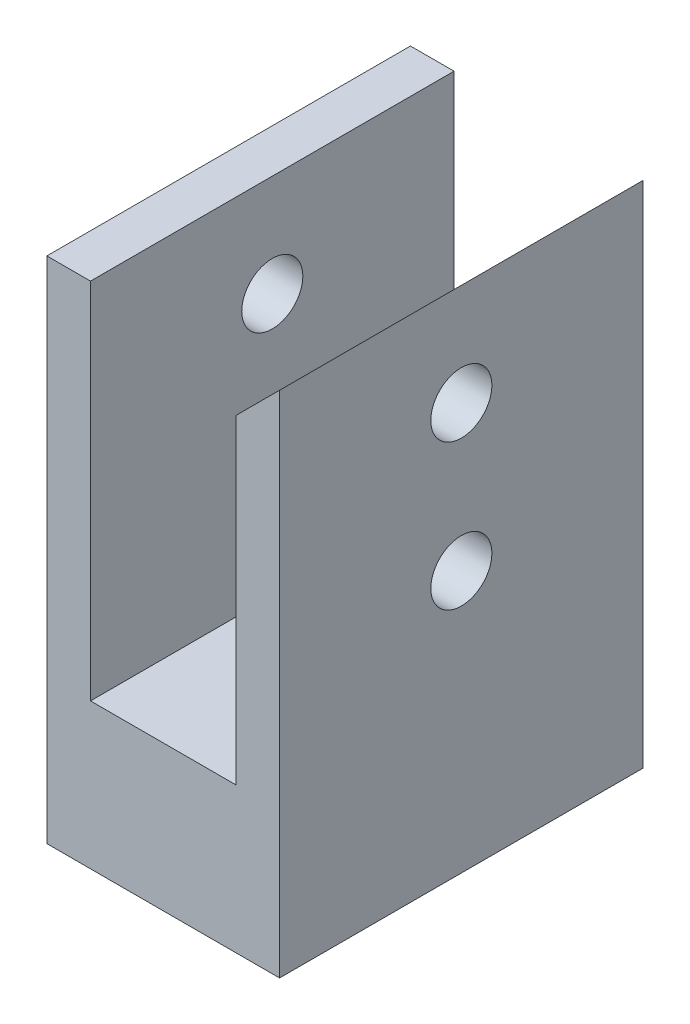
ISO-10303-21;
HEADER;
FILE_DESCRIPTION(('STEP AP214'),'2;1');
FILE_NAME('part.step','',(''),(''),'','','');
FILE_SCHEMA(('AUTOMOTIVE_DESIGN { 1 0 10303 214 1 1 1 1 }'));
ENDSEC;
DATA;
#1=APPLICATION_CONTEXT('core data for automotive mechanical design processes');
#2=APPLICATION_PROTOCOL_DEFINITION('international standard','automotive_design',2000,#1);
#3=PRODUCT_CONTEXT('',#1,'mechanical');
#4=PRODUCT('Part','Part','',(#3));
#5=PRODUCT_RELATED_PRODUCT_CATEGORY('part','',(#4));
#6=PRODUCT_DEFINITION_FORMATION('','',#4);
#7=PRODUCT_DEFINITION_CONTEXT('part definition',#1,'design');
#8=PRODUCT_DEFINITION('design','',#6,#7);
#9=PRODUCT_DEFINITION_SHAPE('','',#8);
#10=(LENGTH_UNIT() NAMED_UNIT(*) SI_UNIT(.MILLI.,.METRE.));
#11=(NAMED_UNIT(*) PLANE_ANGLE_UNIT() SI_UNIT($,.RADIAN.));
#12=(NAMED_UNIT(*) SI_UNIT($,.STERADIAN.) SOLID_ANGLE_UNIT());
#13=UNCERTAINTY_MEASURE_WITH_UNIT(LENGTH_MEASURE(1.E-05),#10,'distance_accuracy_value','');
#14=(GEOMETRIC_REPRESENTATION_CONTEXT(3) GLOBAL_UNCERTAINTY_ASSIGNED_CONTEXT((#13)) GLOBAL_UNIT_ASSIGNED_CONTEXT((#10,
#11,#12)) REPRESENTATION_CONTEXT('',''));
#15=CARTESIAN_POINT('',(0.,0.,0.));
#16=DIRECTION('',(0.,0.,1.));
#17=DIRECTION('',(1.,0.,0.));
#18=AXIS2_PLACEMENT_3D('',#15,#16,#17);
#19=CARTESIAN_POINT('',(-8.,0.,25.));
#20=DIRECTION('',(-1.,0.,0.));
#21=DIRECTION('',(0.,-1.,0.));
#22=AXIS2_PLACEMENT_3D('',#19,#20,#21);
#23=PLANE('',#22);
#24=CARTESIAN_POINT('',(-8.,8.,12.5));
#25=DIRECTION('',(1.,0.,0.));
#26=DIRECTION('',(0.,0.,-1.));
#27=AXIS2_PLACEMENT_3D('',#24,#25,#26);
#28=CIRCLE('',#27,2.1);
#29=CARTESIAN_POINT('',(-8.,8.,10.4));
#30=VERTEX_POINT('',#29);
#31=EDGE_CURVE('E189',#30,#30,#28,.T.);
#32=ORIENTED_EDGE('',*,*,#31,.T.);
#33=EDGE_LOOP('',(#32));
#34=FACE_BOUND('',#33,.T.);
#35=CARTESIAN_POINT('',(-8.,18.,12.5));
#36=DIRECTION('',(1.,0.,0.));
#37=DIRECTION('',(0.,0.,-1.));
#38=AXIS2_PLACEMENT_3D('',#35,#36,#37);
#39=CIRCLE('',#38,2.1);
#40=CARTESIAN_POINT('',(-8.,18.,10.4));
#41=VERTEX_POINT('',#40);
#42=EDGE_CURVE('E196',#41,#41,#39,.T.);
#43=ORIENTED_EDGE('',*,*,#42,.T.);
#44=EDGE_LOOP('',(#43));
#45=FACE_BOUND('',#44,.T.);
#46=DIRECTION('',(0.,1.,0.));
#47=VECTOR('',#46,1.);
#48=CARTESIAN_POINT('',(-8.,0.,0.));
#49=LINE('',#48,#47);
#50=CARTESIAN_POINT('',(-8.,-10.,0.));
#51=VERTEX_POINT('',#50);
#52=CARTESIAN_POINT('',(-8.,25.,0.));
#53=VERTEX_POINT('',#52);
#54=EDGE_CURVE('E144',#51,#53,#49,.T.);
#55=ORIENTED_EDGE('',*,*,#54,.F.);
#56=DIRECTION('',(0.,0.,-1.));
#57=VECTOR('',#56,1.);
#58=CARTESIAN_POINT('',(-8.,-10.,25.));
#59=LINE('',#58,#57);
#60=CARTESIAN_POINT('',(-8.,-10.,25.));
#61=VERTEX_POINT('',#60);
#62=EDGE_CURVE('E11',#61,#51,#59,.T.);
#63=ORIENTED_EDGE('',*,*,#62,.F.);
#64=DIRECTION('',(0.,1.,0.));
#65=VECTOR('',#64,1.);
#66=CARTESIAN_POINT('',(-8.,0.,25.));
#67=LINE('',#66,#65);
#68=CARTESIAN_POINT('',(-8.,25.,25.));
#69=VERTEX_POINT('',#68);
#70=EDGE_CURVE('E170',#61,#69,#67,.T.);
#71=ORIENTED_EDGE('',*,*,#70,.T.);
#72=DIRECTION('',(0.,0.,-1.));
#73=VECTOR('',#72,1.);
#74=CARTESIAN_POINT('',(-8.,25.,25.));
#75=LINE('',#74,#73);
#76=EDGE_CURVE('E60',#69,#53,#75,.T.);
#77=ORIENTED_EDGE('',*,*,#76,.T.);
#78=EDGE_LOOP('',(#55,#63,#71,#77));
#79=FACE_BOUND('',#78,.T.);
#80=ADVANCED_FACE('F41',(#34,#45,#79),#23,.T.);
#81=CARTESIAN_POINT('',(0.,-10.,25.));
#82=DIRECTION('',(0.,1.,0.));
#83=DIRECTION('',(0.,0.,1.));
#84=AXIS2_PLACEMENT_3D('',#81,#82,#83);
#85=PLANE('',#84);
#86=DIRECTION('',(1.,0.,0.));
#87=VECTOR('',#86,1.);
#88=CARTESIAN_POINT('',(0.,-10.,0.));
#89=LINE('',#88,#87);
#90=CARTESIAN_POINT('',(8.,-10.,0.));
#91=VERTEX_POINT('',#90);
#92=EDGE_CURVE('E147',#51,#91,#89,.T.);
#93=ORIENTED_EDGE('',*,*,#92,.T.);
#94=DIRECTION('',(0.,0.,-1.));
#95=VECTOR('',#94,1.);
#96=CARTESIAN_POINT('',(8.,-10.,25.));
#97=LINE('',#96,#95);
#98=CARTESIAN_POINT('',(8.,-10.,25.));
#99=VERTEX_POINT('',#98);
#100=EDGE_CURVE('E51',#99,#91,#97,.T.);
#101=ORIENTED_EDGE('',*,*,#100,.F.);
#102=DIRECTION('',(1.,0.,0.));
#103=VECTOR('',#102,1.);
#104=CARTESIAN_POINT('',(0.,-10.,25.));
#105=LINE('',#104,#103);
#106=EDGE_CURVE('E209',#61,#99,#105,.T.);
#107=ORIENTED_EDGE('',*,*,#106,.F.);
#108=ORIENTED_EDGE('',*,*,#62,.T.);
#109=EDGE_LOOP('',(#93,#101,#107,#108));
#110=FACE_BOUND('',#109,.T.);
#111=ADVANCED_FACE('F240',(#110),#85,.F.);
#112=CARTESIAN_POINT('',(8.,0.,25.));
#113=DIRECTION('',(-1.,0.,0.));
#114=DIRECTION('',(0.,0.,1.));
#115=AXIS2_PLACEMENT_3D('',#112,#113,#114);
#116=PLANE('',#115);
#117=CARTESIAN_POINT('',(8.,8.,12.5));
#118=DIRECTION('',(1.,0.,0.));
#119=DIRECTION('',(0.,0.,-1.));
#120=AXIS2_PLACEMENT_3D('',#117,#118,#119);
#121=CIRCLE('',#120,2.1);
#122=CARTESIAN_POINT('',(8.,8.,10.4));
#123=VERTEX_POINT('',#122);
#124=EDGE_CURVE('E275',#123,#123,#121,.T.);
#125=ORIENTED_EDGE('',*,*,#124,.F.);
#126=EDGE_LOOP('',(#125));
#127=FACE_BOUND('',#126,.T.);
#128=CARTESIAN_POINT('',(8.,18.,12.5));
#129=DIRECTION('',(1.,0.,0.));
#130=DIRECTION('',(0.,0.,-1.));
#131=AXIS2_PLACEMENT_3D('',#128,#129,#130);
#132=CIRCLE('',#131,2.1);
#133=CARTESIAN_POINT('',(8.,18.,10.4));
#134=VERTEX_POINT('',#133);
#135=EDGE_CURVE('E279',#134,#134,#132,.T.);
#136=ORIENTED_EDGE('',*,*,#135,.F.);
#137=EDGE_LOOP('',(#136));
#138=FACE_BOUND('',#137,.T.);
#139=DIRECTION('',(0.,1.,0.));
#140=VECTOR('',#139,1.);
#141=CARTESIAN_POINT('',(8.,0.,0.));
#142=LINE('',#141,#140);
#143=CARTESIAN_POINT('',(8.,25.,0.));
#144=VERTEX_POINT('',#143);
#145=EDGE_CURVE('E150',#91,#144,#142,.T.);
#146=ORIENTED_EDGE('',*,*,#145,.T.);
#147=DIRECTION('',(0.,0.,-1.));
#148=VECTOR('',#147,1.);
#149=CARTESIAN_POINT('',(8.,25.,25.));
#150=LINE('',#149,#148);
#151=CARTESIAN_POINT('',(8.,25.,25.));
#152=VERTEX_POINT('',#151);
#153=EDGE_CURVE('E180',#152,#144,#150,.T.);
#154=ORIENTED_EDGE('',*,*,#153,.F.);
#155=DIRECTION('',(0.,1.,0.));
#156=VECTOR('',#155,1.);
#157=CARTESIAN_POINT('',(8.,0.,25.));
#158=LINE('',#157,#156);
#159=EDGE_CURVE('E212',#99,#152,#158,.T.);
#160=ORIENTED_EDGE('',*,*,#159,.F.);
#161=ORIENTED_EDGE('',*,*,#100,.T.);
#162=EDGE_LOOP('',(#146,#154,#160,#161));
#163=FACE_BOUND('',#162,.T.);
#164=ADVANCED_FACE('F244',(#127,#138,#163),#116,.F.);
#165=CARTESIAN_POINT('',(-8.49999999999999,8.49999999999997,25.));
#166=DIRECTION('',(0.707106781186548,-0.707106781186547,0.));
#167=DIRECTION('',(0.707106781186547,0.707106781186548,0.));
#168=AXIS2_PLACEMENT_3D('',#165,#166,#167);
#169=PLANE('',#168);
#170=DIRECTION('',(-0.707106781186547,-0.707106781186548,0.));
#171=VECTOR('',#170,1.);
#172=CARTESIAN_POINT('',(-8.49999999999999,8.49999999999997,0.));
#173=LINE('',#172,#171);
#174=CARTESIAN_POINT('',(5.,22.,0.));
#175=VERTEX_POINT('',#174);
#176=EDGE_CURVE('E153',#144,#175,#173,.T.);
#177=ORIENTED_EDGE('',*,*,#176,.T.);
#178=DIRECTION('',(0.,0.,-1.));
#179=VECTOR('',#178,1.);
#180=CARTESIAN_POINT('',(5.,22.,25.));
#181=LINE('',#180,#179);
#182=CARTESIAN_POINT('',(5.,22.,25.));
#183=VERTEX_POINT('',#182);
#184=EDGE_CURVE('E177',#183,#175,#181,.T.);
#185=ORIENTED_EDGE('',*,*,#184,.F.);
#186=DIRECTION('',(-0.707106781186547,-0.707106781186548,0.));
#187=VECTOR('',#186,1.);
#188=CARTESIAN_POINT('',(-8.49999999999999,8.49999999999997,25.));
#189=LINE('',#188,#187);
#190=EDGE_CURVE('E138',#152,#183,#189,.T.);
#191=ORIENTED_EDGE('',*,*,#190,.F.);
#192=ORIENTED_EDGE('',*,*,#153,.T.);
#193=EDGE_LOOP('',(#177,#185,#191,#192));
#194=FACE_BOUND('',#193,.T.);
#195=ADVANCED_FACE('F220',(#194),#169,.F.);
#196=CARTESIAN_POINT('',(5.,0.,25.));
#197=DIRECTION('',(-1.,0.,0.));
#198=DIRECTION('',(0.,0.,1.));
#199=AXIS2_PLACEMENT_3D('',#196,#197,#198);
#200=PLANE('',#199);
#201=CARTESIAN_POINT('',(5.,8.,12.5));
#202=DIRECTION('',(-1.,0.,0.));
#203=DIRECTION('',(0.,0.,1.));
#204=AXIS2_PLACEMENT_3D('',#201,#202,#203);
#205=CIRCLE('',#204,2.1);
#206=CARTESIAN_POINT('',(5.,8.,14.6));
#207=VERTEX_POINT('',#206);
#208=EDGE_CURVE('E202',#207,#207,#205,.T.);
#209=ORIENTED_EDGE('',*,*,#208,.F.);
#210=EDGE_LOOP('',(#209));
#211=FACE_BOUND('',#210,.T.);
#212=CARTESIAN_POINT('',(5.,18.,12.5));
#213=DIRECTION('',(-1.,0.,0.));
#214=DIRECTION('',(0.,0.,1.));
#215=AXIS2_PLACEMENT_3D('',#212,#213,#214);
#216=CIRCLE('',#215,2.1);
#217=CARTESIAN_POINT('',(5.,18.,14.6));
#218=VERTEX_POINT('',#217);
#219=EDGE_CURVE('E278',#218,#218,#216,.T.);
#220=ORIENTED_EDGE('',*,*,#219,.F.);
#221=EDGE_LOOP('',(#220));
#222=FACE_BOUND('',#221,.T.);
#223=DIRECTION('',(0.,1.,0.));
#224=VECTOR('',#223,1.);
#225=CARTESIAN_POINT('',(5.,0.,0.));
#226=LINE('',#225,#224);
#227=CARTESIAN_POINT('',(5.,0.,0.));
#228=VERTEX_POINT('',#227);
#229=EDGE_CURVE('E157',#228,#175,#226,.T.);
#230=ORIENTED_EDGE('',*,*,#229,.F.);
#231=DIRECTION('',(0.,0.,-1.));
#232=VECTOR('',#231,1.);
#233=CARTESIAN_POINT('',(5.,0.,25.));
#234=LINE('',#233,#232);
#235=CARTESIAN_POINT('',(5.,0.,25.));
#236=VERTEX_POINT('',#235);
#237=EDGE_CURVE('E121',#236,#228,#234,.T.);
#238=ORIENTED_EDGE('',*,*,#237,.F.);
#239=DIRECTION('',(0.,1.,0.));
#240=VECTOR('',#239,1.);
#241=CARTESIAN_POINT('',(5.,0.,25.));
#242=LINE('',#241,#240);
#243=EDGE_CURVE('E134',#236,#183,#242,.T.);
#244=ORIENTED_EDGE('',*,*,#243,.T.);
#245=ORIENTED_EDGE('',*,*,#184,.T.);
#246=EDGE_LOOP('',(#230,#238,#244,#245));
#247=FACE_BOUND('',#246,.T.);
#248=ADVANCED_FACE('F224',(#211,#222,#247),#200,.T.);
#249=CARTESIAN_POINT('',(0.,0.,25.));
#250=DIRECTION('',(0.,1.,0.));
#251=DIRECTION('',(0.,0.,1.));
#252=AXIS2_PLACEMENT_3D('',#249,#250,#251);
#253=PLANE('',#252);
#254=DIRECTION('',(1.,0.,0.));
#255=VECTOR('',#254,1.);
#256=CARTESIAN_POINT('',(0.,0.,0.));
#257=LINE('',#256,#255);
#258=CARTESIAN_POINT('',(-5.,0.,0.));
#259=VERTEX_POINT('',#258);
#260=EDGE_CURVE('E117',#259,#228,#257,.T.);
#261=ORIENTED_EDGE('',*,*,#260,.F.);
#262=DIRECTION('',(0.,0.,-1.));
#263=VECTOR('',#262,1.);
#264=CARTESIAN_POINT('',(-5.,0.,25.));
#265=LINE('',#264,#263);
#266=CARTESIAN_POINT('',(-5.,0.,25.));
#267=VERTEX_POINT('',#266);
#268=EDGE_CURVE('E111',#267,#259,#265,.T.);
#269=ORIENTED_EDGE('',*,*,#268,.F.);
#270=DIRECTION('',(1.,0.,0.));
#271=VECTOR('',#270,1.);
#272=CARTESIAN_POINT('',(0.,0.,25.));
#273=LINE('',#272,#271);
#274=EDGE_CURVE('E115',#267,#236,#273,.T.);
#275=ORIENTED_EDGE('',*,*,#274,.T.);
#276=ORIENTED_EDGE('',*,*,#237,.T.);
#277=EDGE_LOOP('',(#261,#269,#275,#276));
#278=FACE_BOUND('',#277,.T.);
#279=ADVANCED_FACE('F113',(#278),#253,.T.);
#280=CARTESIAN_POINT('',(-5.,0.,25.));
#281=DIRECTION('',(-1.,0.,0.));
#282=DIRECTION('',(0.,0.,1.));
#283=AXIS2_PLACEMENT_3D('',#280,#281,#282);
#284=PLANE('',#283);
#285=CARTESIAN_POINT('',(-5.,8.,12.5));
#286=DIRECTION('',(-1.,0.,0.));
#287=DIRECTION('',(0.,0.,1.));
#288=AXIS2_PLACEMENT_3D('',#285,#286,#287);
#289=CIRCLE('',#288,2.1);
#290=CARTESIAN_POINT('',(-5.,8.,14.6));
#291=VERTEX_POINT('',#290);
#292=EDGE_CURVE('E44',#291,#291,#289,.T.);
#293=ORIENTED_EDGE('',*,*,#292,.T.);
#294=EDGE_LOOP('',(#293));
#295=FACE_BOUND('',#294,.T.);
#296=CARTESIAN_POINT('',(-5.,18.,12.5));
#297=DIRECTION('',(-1.,0.,0.));
#298=DIRECTION('',(0.,0.,1.));
#299=AXIS2_PLACEMENT_3D('',#296,#297,#298);
#300=CIRCLE('',#299,2.1);
#301=CARTESIAN_POINT('',(-5.,18.,14.6));
#302=VERTEX_POINT('',#301);
#303=EDGE_CURVE('E186',#302,#302,#300,.T.);
#304=ORIENTED_EDGE('',*,*,#303,.T.);
#305=EDGE_LOOP('',(#304));
#306=FACE_BOUND('',#305,.T.);
#307=DIRECTION('',(0.,1.,0.));
#308=VECTOR('',#307,1.);
#309=CARTESIAN_POINT('',(-5.,0.,0.));
#310=LINE('',#309,#308);
#311=CARTESIAN_POINT('',(-5.,25.,0.));
#312=VERTEX_POINT('',#311);
#313=EDGE_CURVE('E163',#259,#312,#310,.T.);
#314=ORIENTED_EDGE('',*,*,#313,.T.);
#315=DIRECTION('',(0.,0.,-1.));
#316=VECTOR('',#315,1.);
#317=CARTESIAN_POINT('',(-5.,25.,25.));
#318=LINE('',#317,#316);
#319=CARTESIAN_POINT('',(-5.,25.,25.));
#320=VERTEX_POINT('',#319);
#321=EDGE_CURVE('E86',#320,#312,#318,.T.);
#322=ORIENTED_EDGE('',*,*,#321,.F.);
#323=DIRECTION('',(0.,1.,0.));
#324=VECTOR('',#323,1.);
#325=CARTESIAN_POINT('',(-5.,0.,25.));
#326=LINE('',#325,#324);
#327=EDGE_CURVE('E123',#267,#320,#326,.T.);
#328=ORIENTED_EDGE('',*,*,#327,.F.);
#329=ORIENTED_EDGE('',*,*,#268,.T.);
#330=EDGE_LOOP('',(#314,#322,#328,#329));
#331=FACE_BOUND('',#330,.T.);
#332=ADVANCED_FACE('F124',(#295,#306,#331),#284,.F.);
#333=CARTESIAN_POINT('',(0.,25.,25.));
#334=DIRECTION('',(0.,1.,0.));
#335=DIRECTION('',(0.,0.,1.));
#336=AXIS2_PLACEMENT_3D('',#333,#334,#335);
#337=PLANE('',#336);
#338=DIRECTION('',(1.,0.,0.));
#339=VECTOR('',#338,1.);
#340=CARTESIAN_POINT('',(0.,25.,0.));
#341=LINE('',#340,#339);
#342=EDGE_CURVE('E166',#53,#312,#341,.T.);
#343=ORIENTED_EDGE('',*,*,#342,.F.);
#344=ORIENTED_EDGE('',*,*,#76,.F.);
#345=DIRECTION('',(1.,0.,0.));
#346=VECTOR('',#345,1.);
#347=CARTESIAN_POINT('',(0.,25.,25.));
#348=LINE('',#347,#346);
#349=EDGE_CURVE('E128',#69,#320,#348,.T.);
#350=ORIENTED_EDGE('',*,*,#349,.T.);
#351=ORIENTED_EDGE('',*,*,#321,.T.);
#352=EDGE_LOOP('',(#343,#344,#350,#351));
#353=FACE_BOUND('',#352,.T.);
#354=ADVANCED_FACE('F228',(#353),#337,.T.);
#355=CARTESIAN_POINT('',(0.,0.,25.));
#356=DIRECTION('',(0.,0.,1.));
#357=DIRECTION('',(1.,0.,0.));
#358=AXIS2_PLACEMENT_3D('',#355,#356,#357);
#359=PLANE('',#358);
#360=ORIENTED_EDGE('',*,*,#70,.F.);
#361=ORIENTED_EDGE('',*,*,#106,.T.);
#362=ORIENTED_EDGE('',*,*,#159,.T.);
#363=ORIENTED_EDGE('',*,*,#190,.T.);
#364=ORIENTED_EDGE('',*,*,#243,.F.);
#365=ORIENTED_EDGE('',*,*,#274,.F.);
#366=ORIENTED_EDGE('',*,*,#327,.T.);
#367=ORIENTED_EDGE('',*,*,#349,.F.);
#368=EDGE_LOOP('',(#360,#361,#362,#363,#364,#365,#366,#367));
#369=FACE_BOUND('',#368,.T.);
#370=ADVANCED_FACE('F132',(#369),#359,.T.);
#371=CARTESIAN_POINT('',(0.,0.,0.));
#372=DIRECTION('',(0.,0.,1.));
#373=DIRECTION('',(1.,0.,0.));
#374=AXIS2_PLACEMENT_3D('',#371,#372,#373);
#375=PLANE('',#374);
#376=ORIENTED_EDGE('',*,*,#54,.T.);
#377=ORIENTED_EDGE('',*,*,#342,.T.);
#378=ORIENTED_EDGE('',*,*,#313,.F.);
#379=ORIENTED_EDGE('',*,*,#260,.T.);
#380=ORIENTED_EDGE('',*,*,#229,.T.);
#381=ORIENTED_EDGE('',*,*,#176,.F.);
#382=ORIENTED_EDGE('',*,*,#145,.F.);
#383=ORIENTED_EDGE('',*,*,#92,.F.);
#384=EDGE_LOOP('',(#376,#377,#378,#379,#380,#381,#382,#383));
#385=FACE_BOUND('',#384,.T.);
#386=ADVANCED_FACE('F226',(#385),#375,.F.);
#387=CARTESIAN_POINT('',(-8.,18.,12.5));
#388=DIRECTION('',(1.,0.,0.));
#389=DIRECTION('',(0.,0.,-1.));
#390=AXIS2_PLACEMENT_3D('',#387,#388,#389);
#391=CYLINDRICAL_SURFACE('',#390,2.1);
#392=ORIENTED_EDGE('',*,*,#42,.F.);
#393=EDGE_LOOP('',(#392));
#394=FACE_BOUND('',#393,.T.);
#395=ORIENTED_EDGE('',*,*,#303,.F.);
#396=EDGE_LOOP('',(#395));
#397=FACE_BOUND('',#396,.T.);
#398=ADVANCED_FACE('F249',(#394,#397),#391,.F.);
#399=CARTESIAN_POINT('',(-8.,8.,12.5));
#400=DIRECTION('',(1.,0.,0.));
#401=DIRECTION('',(0.,0.,-1.));
#402=AXIS2_PLACEMENT_3D('',#399,#400,#401);
#403=CYLINDRICAL_SURFACE('',#402,2.1);
#404=ORIENTED_EDGE('',*,*,#31,.F.);
#405=EDGE_LOOP('',(#404));
#406=FACE_BOUND('',#405,.T.);
#407=ORIENTED_EDGE('',*,*,#292,.F.);
#408=EDGE_LOOP('',(#407));
#409=FACE_BOUND('',#408,.T.);
#410=ADVANCED_FACE('F252',(#406,#409),#403,.F.);
#411=CARTESIAN_POINT('',(-8.,18.,12.5));
#412=DIRECTION('',(1.,0.,0.));
#413=DIRECTION('',(0.,0.,-1.));
#414=AXIS2_PLACEMENT_3D('',#411,#412,#413);
#415=CYLINDRICAL_SURFACE('',#414,2.1);
#416=ORIENTED_EDGE('',*,*,#219,.T.);
#417=EDGE_LOOP('',(#416));
#418=FACE_BOUND('',#417,.T.);
#419=ORIENTED_EDGE('',*,*,#135,.T.);
#420=EDGE_LOOP('',(#419));
#421=FACE_BOUND('',#420,.T.);
#422=ADVANCED_FACE('F258',(#418,#421),#415,.F.);
#423=CARTESIAN_POINT('',(-8.,8.,12.5));
#424=DIRECTION('',(1.,0.,0.));
#425=DIRECTION('',(0.,0.,-1.));
#426=AXIS2_PLACEMENT_3D('',#423,#424,#425);
#427=CYLINDRICAL_SURFACE('',#426,2.1);
#428=ORIENTED_EDGE('',*,*,#208,.T.);
#429=EDGE_LOOP('',(#428));
#430=FACE_BOUND('',#429,.T.);
#431=ORIENTED_EDGE('',*,*,#124,.T.);
#432=EDGE_LOOP('',(#431));
#433=FACE_BOUND('',#432,.T.);
#434=ADVANCED_FACE('F264',(#430,#433),#427,.F.);
#435=CLOSED_SHELL('',(#80,#111,#164,#195,#248,#279,#332,#354,#370,#386,#398,#410,#422,#434));
#436=MANIFOLD_SOLID_BREP('B2',#435);
#437=ADVANCED_BREP_SHAPE_REPRESENTATION('',(#18,#436),#14);
#438=SHAPE_DEFINITION_REPRESENTATION(#9,#437);
ENDSEC;
END-ISO-10303-21;
